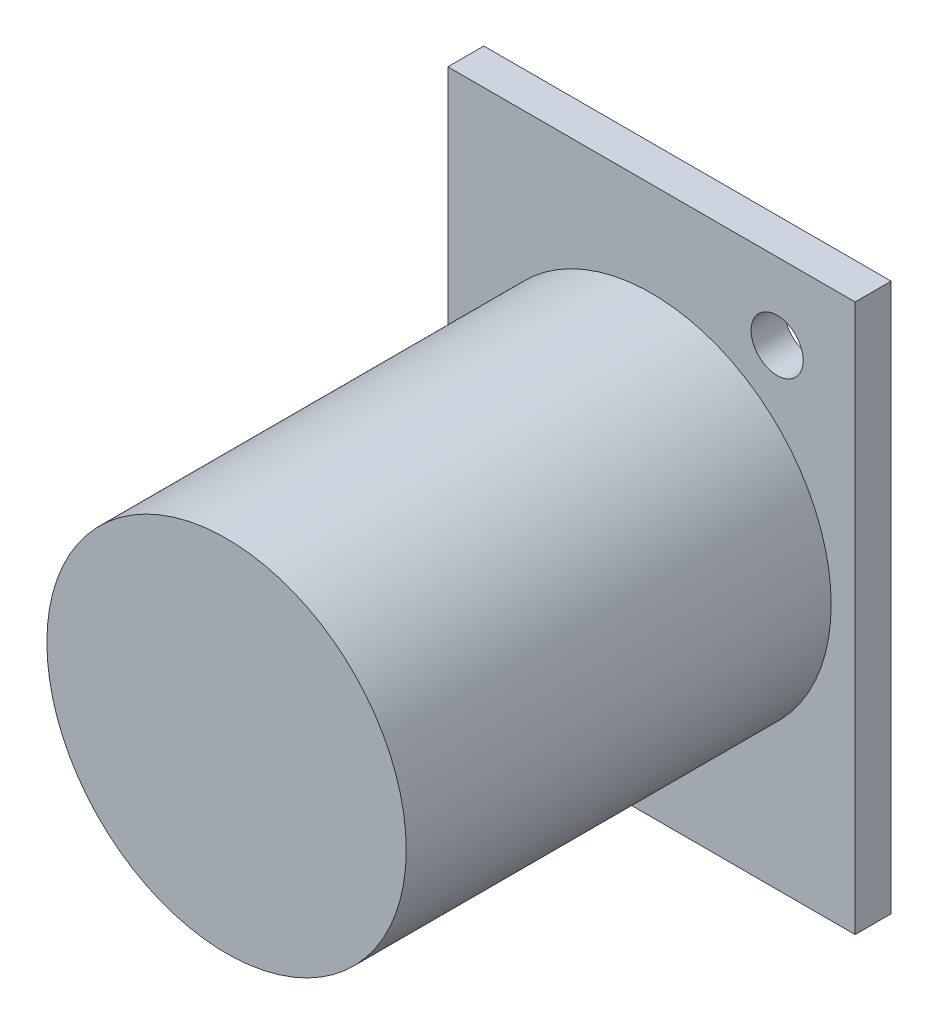
ISO-10303-21;
HEADER;
FILE_DESCRIPTION(('STEP AP214'),'2;1');
FILE_NAME('part.step','',(''),(''),'','','');
FILE_SCHEMA(('AUTOMOTIVE_DESIGN { 1 0 10303 214 1 1 1 1 }'));
ENDSEC;
DATA;
#1=APPLICATION_CONTEXT('core data for automotive mechanical design processes');
#2=APPLICATION_PROTOCOL_DEFINITION('international standard','automotive_design',2000,#1);
#3=PRODUCT_CONTEXT('',#1,'mechanical');
#4=PRODUCT('Part','Part','',(#3));
#5=PRODUCT_RELATED_PRODUCT_CATEGORY('part','',(#4));
#6=PRODUCT_DEFINITION_FORMATION('','',#4);
#7=PRODUCT_DEFINITION_CONTEXT('part definition',#1,'design');
#8=PRODUCT_DEFINITION('design','',#6,#7);
#9=PRODUCT_DEFINITION_SHAPE('','',#8);
#10=(LENGTH_UNIT() NAMED_UNIT(*) SI_UNIT(.MILLI.,.METRE.));
#11=(NAMED_UNIT(*) PLANE_ANGLE_UNIT() SI_UNIT($,.RADIAN.));
#12=(NAMED_UNIT(*) SI_UNIT($,.STERADIAN.) SOLID_ANGLE_UNIT());
#13=UNCERTAINTY_MEASURE_WITH_UNIT(LENGTH_MEASURE(1.E-05),#10,'distance_accuracy_value','');
#14=(GEOMETRIC_REPRESENTATION_CONTEXT(3) GLOBAL_UNCERTAINTY_ASSIGNED_CONTEXT((#13)) GLOBAL_UNIT_ASSIGNED_CONTEXT((#10,
#11,#12)) REPRESENTATION_CONTEXT('',''));
#15=CARTESIAN_POINT('',(0.,0.,0.));
#16=DIRECTION('',(0.,0.,1.));
#17=DIRECTION('',(1.,0.,0.));
#18=AXIS2_PLACEMENT_3D('',#15,#16,#17);
#19=CARTESIAN_POINT('',(0.,0.,2.3876));
#20=DIRECTION('',(0.,0.,-1.));
#21=DIRECTION('',(-1.,0.,0.));
#22=AXIS2_PLACEMENT_3D('',#19,#20,#21);
#23=PLANE('',#22);
#24=CARTESIAN_POINT('',(5.1689,5.08,2.3876));
#25=DIRECTION('',(0.,0.,-1.));
#26=DIRECTION('',(-1.,0.,0.));
#27=AXIS2_PLACEMENT_3D('',#24,#25,#26);
#28=CIRCLE('',#27,1.7272);
#29=CARTESIAN_POINT('',(3.4417,5.08,2.3876));
#30=VERTEX_POINT('',#29);
#31=EDGE_CURVE('E137',#30,#30,#28,.F.);
#32=ORIENTED_EDGE('',*,*,#31,.F.);
#33=EDGE_LOOP('',(#32));
#34=FACE_BOUND('',#33,.T.);
#35=CARTESIAN_POINT('',(21.8313,31.242,2.3876));
#36=DIRECTION('',(0.,0.,-1.));
#37=DIRECTION('',(-1.,0.,0.));
#38=AXIS2_PLACEMENT_3D('',#35,#36,#37);
#39=CIRCLE('',#38,1.7272);
#40=CARTESIAN_POINT('',(20.1041,31.242,2.3876));
#41=VERTEX_POINT('',#40);
#42=EDGE_CURVE('E139',#41,#41,#39,.F.);
#43=ORIENTED_EDGE('',*,*,#42,.F.);
#44=EDGE_LOOP('',(#43));
#45=FACE_BOUND('',#44,.T.);
#46=DIRECTION('',(0.,-1.,0.));
#47=VECTOR('',#46,1.);
#48=CARTESIAN_POINT('',(0.,0.,2.3876));
#49=LINE('',#48,#47);
#50=CARTESIAN_POINT('',(0.,36.322,2.3876));
#51=VERTEX_POINT('',#50);
#52=CARTESIAN_POINT('',(0.,0.,2.3876));
#53=VERTEX_POINT('',#52);
#54=EDGE_CURVE('E86',#51,#53,#49,.T.);
#55=ORIENTED_EDGE('',*,*,#54,.T.);
#56=DIRECTION('',(1.,0.,0.));
#57=VECTOR('',#56,1.);
#58=CARTESIAN_POINT('',(0.,0.,2.3876));
#59=LINE('',#58,#57);
#60=CARTESIAN_POINT('',(27.0002,0.,2.3876));
#61=VERTEX_POINT('',#60);
#62=EDGE_CURVE('E81',#53,#61,#59,.T.);
#63=ORIENTED_EDGE('',*,*,#62,.T.);
#64=DIRECTION('',(0.,1.,0.));
#65=VECTOR('',#64,1.);
#66=CARTESIAN_POINT('',(27.0002,0.,2.3876));
#67=LINE('',#66,#65);
#68=CARTESIAN_POINT('',(27.0002,36.322,2.3876));
#69=VERTEX_POINT('',#68);
#70=EDGE_CURVE('E84',#61,#69,#67,.T.);
#71=ORIENTED_EDGE('',*,*,#70,.T.);
#72=DIRECTION('',(-1.,0.,0.));
#73=VECTOR('',#72,1.);
#74=CARTESIAN_POINT('',(0.,36.322,2.3876));
#75=LINE('',#74,#73);
#76=EDGE_CURVE('E50',#69,#51,#75,.T.);
#77=ORIENTED_EDGE('',*,*,#76,.T.);
#78=EDGE_LOOP('',(#55,#63,#71,#77));
#79=FACE_BOUND('',#78,.T.);
#80=CARTESIAN_POINT('',(13.5001,18.161,2.3876));
#81=DIRECTION('',(0.,0.,-1.));
#82=DIRECTION('',(-1.,0.,0.));
#83=AXIS2_PLACEMENT_3D('',#80,#81,#82);
#84=CIRCLE('',#83,11.9126);
#85=CARTESIAN_POINT('',(1.5875,18.161,2.3876));
#86=VERTEX_POINT('',#85);
#87=EDGE_CURVE('E111',#86,#86,#84,.F.);
#88=ORIENTED_EDGE('',*,*,#87,.F.);
#89=EDGE_LOOP('',(#88));
#90=FACE_BOUND('',#89,.T.);
#91=ADVANCED_FACE('F33',(#34,#45,#79,#90),#23,.F.);
#92=CARTESIAN_POINT('',(0.,0.,2.3876));
#93=DIRECTION('',(1.,0.,0.));
#94=DIRECTION('',(0.,0.,-1.));
#95=AXIS2_PLACEMENT_3D('',#92,#93,#94);
#96=PLANE('',#95);
#97=DIRECTION('',(0.,-1.,0.));
#98=VECTOR('',#97,1.);
#99=CARTESIAN_POINT('',(0.,0.,0.));
#100=LINE('',#99,#98);
#101=CARTESIAN_POINT('',(0.,36.322,0.));
#102=VERTEX_POINT('',#101);
#103=CARTESIAN_POINT('',(0.,0.,0.));
#104=VERTEX_POINT('',#103);
#105=EDGE_CURVE('E101',#102,#104,#100,.T.);
#106=ORIENTED_EDGE('',*,*,#105,.T.);
#107=DIRECTION('',(0.,0.,-1.));
#108=VECTOR('',#107,1.);
#109=CARTESIAN_POINT('',(0.,0.,2.3876));
#110=LINE('',#109,#108);
#111=EDGE_CURVE('E92',#53,#104,#110,.T.);
#112=ORIENTED_EDGE('',*,*,#111,.F.);
#113=ORIENTED_EDGE('',*,*,#54,.F.);
#114=DIRECTION('',(0.,0.,-1.));
#115=VECTOR('',#114,1.);
#116=CARTESIAN_POINT('',(0.,36.322,2.3876));
#117=LINE('',#116,#115);
#118=EDGE_CURVE('E97',#51,#102,#117,.T.);
#119=ORIENTED_EDGE('',*,*,#118,.T.);
#120=EDGE_LOOP('',(#106,#112,#113,#119));
#121=FACE_BOUND('',#120,.T.);
#122=ADVANCED_FACE('F161',(#121),#96,.F.);
#123=CARTESIAN_POINT('',(0.,0.,2.3876));
#124=DIRECTION('',(0.,1.,0.));
#125=DIRECTION('',(0.,0.,1.));
#126=AXIS2_PLACEMENT_3D('',#123,#124,#125);
#127=PLANE('',#126);
#128=DIRECTION('',(1.,0.,0.));
#129=VECTOR('',#128,1.);
#130=CARTESIAN_POINT('',(0.,0.,0.));
#131=LINE('',#130,#129);
#132=CARTESIAN_POINT('',(27.0002,0.,0.));
#133=VERTEX_POINT('',#132);
#134=EDGE_CURVE('E91',#104,#133,#131,.T.);
#135=ORIENTED_EDGE('',*,*,#134,.T.);
#136=DIRECTION('',(0.,0.,-1.));
#137=VECTOR('',#136,1.);
#138=CARTESIAN_POINT('',(27.0002,0.,2.3876));
#139=LINE('',#138,#137);
#140=EDGE_CURVE('E89',#61,#133,#139,.T.);
#141=ORIENTED_EDGE('',*,*,#140,.F.);
#142=ORIENTED_EDGE('',*,*,#62,.F.);
#143=ORIENTED_EDGE('',*,*,#111,.T.);
#144=EDGE_LOOP('',(#135,#141,#142,#143));
#145=FACE_BOUND('',#144,.T.);
#146=ADVANCED_FACE('F90',(#145),#127,.F.);
#147=CARTESIAN_POINT('',(27.0002,0.,2.3876));
#148=DIRECTION('',(-1.,0.,0.));
#149=DIRECTION('',(0.,0.,1.));
#150=AXIS2_PLACEMENT_3D('',#147,#148,#149);
#151=PLANE('',#150);
#152=DIRECTION('',(0.,1.,0.));
#153=VECTOR('',#152,1.);
#154=CARTESIAN_POINT('',(27.0002,0.,0.));
#155=LINE('',#154,#153);
#156=CARTESIAN_POINT('',(27.0002,36.322,0.));
#157=VERTEX_POINT('',#156);
#158=EDGE_CURVE('E67',#133,#157,#155,.T.);
#159=ORIENTED_EDGE('',*,*,#158,.T.);
#160=DIRECTION('',(0.,0.,-1.));
#161=VECTOR('',#160,1.);
#162=CARTESIAN_POINT('',(27.0002,36.322,2.3876));
#163=LINE('',#162,#161);
#164=EDGE_CURVE('E93',#69,#157,#163,.T.);
#165=ORIENTED_EDGE('',*,*,#164,.F.);
#166=ORIENTED_EDGE('',*,*,#70,.F.);
#167=ORIENTED_EDGE('',*,*,#140,.T.);
#168=EDGE_LOOP('',(#159,#165,#166,#167));
#169=FACE_BOUND('',#168,.T.);
#170=ADVANCED_FACE('F95',(#169),#151,.F.);
#171=CARTESIAN_POINT('',(0.,36.322,2.3876));
#172=DIRECTION('',(0.,-1.,0.));
#173=DIRECTION('',(0.,0.,-1.));
#174=AXIS2_PLACEMENT_3D('',#171,#172,#173);
#175=PLANE('',#174);
#176=DIRECTION('',(-1.,0.,0.));
#177=VECTOR('',#176,1.);
#178=CARTESIAN_POINT('',(0.,36.322,0.));
#179=LINE('',#178,#177);
#180=EDGE_CURVE('E73',#157,#102,#179,.T.);
#181=ORIENTED_EDGE('',*,*,#180,.T.);
#182=ORIENTED_EDGE('',*,*,#118,.F.);
#183=ORIENTED_EDGE('',*,*,#76,.F.);
#184=ORIENTED_EDGE('',*,*,#164,.T.);
#185=EDGE_LOOP('',(#181,#182,#183,#184));
#186=FACE_BOUND('',#185,.T.);
#187=ADVANCED_FACE('F173',(#186),#175,.F.);
#188=CARTESIAN_POINT('',(0.,0.,0.));
#189=DIRECTION('',(0.,0.,-1.));
#190=DIRECTION('',(-1.,0.,0.));
#191=AXIS2_PLACEMENT_3D('',#188,#189,#190);
#192=PLANE('',#191);
#193=CARTESIAN_POINT('',(5.1689,5.08,0.));
#194=DIRECTION('',(0.,0.,-1.));
#195=DIRECTION('',(-1.,0.,0.));
#196=AXIS2_PLACEMENT_3D('',#193,#194,#195);
#197=CIRCLE('',#196,2.85750000000002);
#198=CARTESIAN_POINT('',(2.31139999999998,5.08,0.));
#199=VERTEX_POINT('',#198);
#200=EDGE_CURVE('E42',#199,#199,#197,.F.);
#201=ORIENTED_EDGE('',*,*,#200,.T.);
#202=EDGE_LOOP('',(#201));
#203=FACE_BOUND('',#202,.T.);
#204=CARTESIAN_POINT('',(21.8313,31.242,0.));
#205=DIRECTION('',(0.,0.,-1.));
#206=DIRECTION('',(-1.,0.,0.));
#207=AXIS2_PLACEMENT_3D('',#204,#205,#206);
#208=CIRCLE('',#207,2.85750000000003);
#209=CARTESIAN_POINT('',(18.9738,31.242,0.));
#210=VERTEX_POINT('',#209);
#211=EDGE_CURVE('E117',#210,#210,#208,.F.);
#212=ORIENTED_EDGE('',*,*,#211,.T.);
#213=EDGE_LOOP('',(#212));
#214=FACE_BOUND('',#213,.T.);
#215=CARTESIAN_POINT('',(13.5001,18.161,0.));
#216=DIRECTION('',(0.,0.,-1.));
#217=DIRECTION('',(-1.,0.,0.));
#218=AXIS2_PLACEMENT_3D('',#215,#216,#217);
#219=CIRCLE('',#218,10.6426);
#220=CARTESIAN_POINT('',(2.8575,18.161,0.));
#221=VERTEX_POINT('',#220);
#222=EDGE_CURVE('E142',#221,#221,#219,.T.);
#223=ORIENTED_EDGE('',*,*,#222,.F.);
#224=EDGE_LOOP('',(#223));
#225=FACE_BOUND('',#224,.T.);
#226=ORIENTED_EDGE('',*,*,#105,.F.);
#227=ORIENTED_EDGE('',*,*,#180,.F.);
#228=ORIENTED_EDGE('',*,*,#158,.F.);
#229=ORIENTED_EDGE('',*,*,#134,.F.);
#230=EDGE_LOOP('',(#226,#227,#228,#229));
#231=FACE_BOUND('',#230,.T.);
#232=ADVANCED_FACE('F122',(#203,#214,#225,#231),#192,.T.);
#233=CARTESIAN_POINT('',(13.5001,18.161,30.5562));
#234=DIRECTION('',(0.,0.,-1.));
#235=DIRECTION('',(-1.,0.,0.));
#236=AXIS2_PLACEMENT_3D('',#233,#234,#235);
#237=CYLINDRICAL_SURFACE('',#236,11.9126);
#238=CARTESIAN_POINT('',(13.5001,18.161,30.5562));
#239=DIRECTION('',(0.,0.,1.));
#240=DIRECTION('',(1.,0.,0.));
#241=AXIS2_PLACEMENT_3D('',#238,#239,#240);
#242=CIRCLE('',#241,11.9126);
#243=CARTESIAN_POINT('',(25.4127,18.161,30.5562));
#244=VERTEX_POINT('',#243);
#245=EDGE_CURVE('E104',#244,#244,#242,.T.);
#246=ORIENTED_EDGE('',*,*,#245,.F.);
#247=EDGE_LOOP('',(#246));
#248=FACE_BOUND('',#247,.T.);
#249=ORIENTED_EDGE('',*,*,#87,.T.);
#250=EDGE_LOOP('',(#249));
#251=FACE_BOUND('',#250,.T.);
#252=ADVANCED_FACE('F155',(#248,#251),#237,.T.);
#253=CARTESIAN_POINT('',(13.5001,18.161,30.5562));
#254=DIRECTION('',(0.,0.,1.));
#255=DIRECTION('',(1.,0.,0.));
#256=AXIS2_PLACEMENT_3D('',#253,#254,#255);
#257=PLANE('',#256);
#258=ORIENTED_EDGE('',*,*,#245,.T.);
#259=EDGE_LOOP('',(#258));
#260=FACE_BOUND('',#259,.T.);
#261=ADVANCED_FACE('F153',(#260),#257,.T.);
#262=CARTESIAN_POINT('',(13.5001,18.161,28.1686));
#263=DIRECTION('',(0.,0.,-1.));
#264=DIRECTION('',(-1.,0.,0.));
#265=AXIS2_PLACEMENT_3D('',#262,#263,#264);
#266=CYLINDRICAL_SURFACE('',#265,10.6426);
#267=CARTESIAN_POINT('',(13.5001,18.161,28.1686));
#268=DIRECTION('',(0.,0.,-1.));
#269=DIRECTION('',(-1.,0.,0.));
#270=AXIS2_PLACEMENT_3D('',#267,#268,#269);
#271=CIRCLE('',#270,10.6426);
#272=CARTESIAN_POINT('',(2.8575,18.161,28.1686));
#273=VERTEX_POINT('',#272);
#274=EDGE_CURVE('E145',#273,#273,#271,.T.);
#275=ORIENTED_EDGE('',*,*,#274,.F.);
#276=EDGE_LOOP('',(#275));
#277=FACE_BOUND('',#276,.T.);
#278=ORIENTED_EDGE('',*,*,#222,.T.);
#279=EDGE_LOOP('',(#278));
#280=FACE_BOUND('',#279,.T.);
#281=ADVANCED_FACE('F206',(#277,#280),#266,.F.);
#282=CARTESIAN_POINT('',(13.5001,18.161,28.1686));
#283=DIRECTION('',(0.,0.,-1.));
#284=DIRECTION('',(-1.,0.,0.));
#285=AXIS2_PLACEMENT_3D('',#282,#283,#284);
#286=PLANE('',#285);
#287=ORIENTED_EDGE('',*,*,#274,.T.);
#288=EDGE_LOOP('',(#287));
#289=FACE_BOUND('',#288,.T.);
#290=ADVANCED_FACE('F212',(#289),#286,.T.);
#291=CARTESIAN_POINT('',(21.8313,31.242,30.5572));
#292=DIRECTION('',(0.,0.,-1.));
#293=DIRECTION('',(-1.,0.,0.));
#294=AXIS2_PLACEMENT_3D('',#291,#292,#293);
#295=CYLINDRICAL_SURFACE('',#294,1.7272);
#296=CARTESIAN_POINT('',(21.8313,31.242,0.158853305464113));
#297=DIRECTION('',(0.,0.,-1.));
#298=DIRECTION('',(-1.,0.,0.));
#299=AXIS2_PLACEMENT_3D('',#296,#297,#298);
#300=CIRCLE('',#299,1.7272);
#301=CARTESIAN_POINT('',(20.1041,31.242,0.158853305464113));
#302=VERTEX_POINT('',#301);
#303=EDGE_CURVE('E11',#302,#302,#300,.T.);
#304=ORIENTED_EDGE('',*,*,#303,.T.);
#305=EDGE_LOOP('',(#304));
#306=FACE_BOUND('',#305,.T.);
#307=ORIENTED_EDGE('',*,*,#42,.T.);
#308=EDGE_LOOP('',(#307));
#309=FACE_BOUND('',#308,.T.);
#310=ADVANCED_FACE('F133',(#306,#309),#295,.F.);
#311=CARTESIAN_POINT('',(5.1689,5.08,30.5572));
#312=DIRECTION('',(0.,0.,-1.));
#313=DIRECTION('',(-1.,0.,0.));
#314=AXIS2_PLACEMENT_3D('',#311,#312,#313);
#315=CYLINDRICAL_SURFACE('',#314,1.7272);
#316=CARTESIAN_POINT('',(5.1689,5.08,0.158853305464113));
#317=DIRECTION('',(0.,0.,-1.));
#318=DIRECTION('',(-1.,0.,0.));
#319=AXIS2_PLACEMENT_3D('',#316,#317,#318);
#320=CIRCLE('',#319,1.7272);
#321=CARTESIAN_POINT('',(3.4417,5.08,0.158853305464113));
#322=VERTEX_POINT('',#321);
#323=EDGE_CURVE('E114',#322,#322,#320,.T.);
#324=ORIENTED_EDGE('',*,*,#323,.T.);
#325=EDGE_LOOP('',(#324));
#326=FACE_BOUND('',#325,.T.);
#327=ORIENTED_EDGE('',*,*,#31,.T.);
#328=EDGE_LOOP('',(#327));
#329=FACE_BOUND('',#328,.T.);
#330=ADVANCED_FACE('F128',(#326,#329),#315,.F.);
#331=CARTESIAN_POINT('',(5.1689,5.08,0.158853305464113));
#332=DIRECTION('',(0.,0.,-1.));
#333=DIRECTION('',(-1.,0.,0.));
#334=AXIS2_PLACEMENT_3D('',#331,#332,#333);
#335=CONICAL_SURFACE('',#334,1.7272,1.43116998663535);
#336=ORIENTED_EDGE('',*,*,#200,.F.);
#337=EDGE_LOOP('',(#336));
#338=FACE_BOUND('',#337,.T.);
#339=ORIENTED_EDGE('',*,*,#323,.F.);
#340=EDGE_LOOP('',(#339));
#341=FACE_BOUND('',#340,.T.);
#342=ADVANCED_FACE('F125',(#338,#341),#335,.F.);
#343=CARTESIAN_POINT('',(21.8313,31.242,0.158853305464113));
#344=DIRECTION('',(0.,0.,-1.));
#345=DIRECTION('',(-1.,0.,0.));
#346=AXIS2_PLACEMENT_3D('',#343,#344,#345);
#347=CONICAL_SURFACE('',#346,1.7272,1.43116998663535);
#348=ORIENTED_EDGE('',*,*,#211,.F.);
#349=EDGE_LOOP('',(#348));
#350=FACE_BOUND('',#349,.T.);
#351=ORIENTED_EDGE('',*,*,#303,.F.);
#352=EDGE_LOOP('',(#351));
#353=FACE_BOUND('',#352,.T.);
#354=ADVANCED_FACE('F35',(#350,#353),#347,.F.);
#355=CLOSED_SHELL('',(#91,#122,#146,#170,#187,#232,#252,#261,#281,#290,#310,#330,#342,#354));
#356=MANIFOLD_SOLID_BREP('B2',#355);
#357=ADVANCED_BREP_SHAPE_REPRESENTATION('',(#18,#356),#14);
#358=SHAPE_DEFINITION_REPRESENTATION(#9,#357);
ENDSEC;
END-ISO-10303-21;
